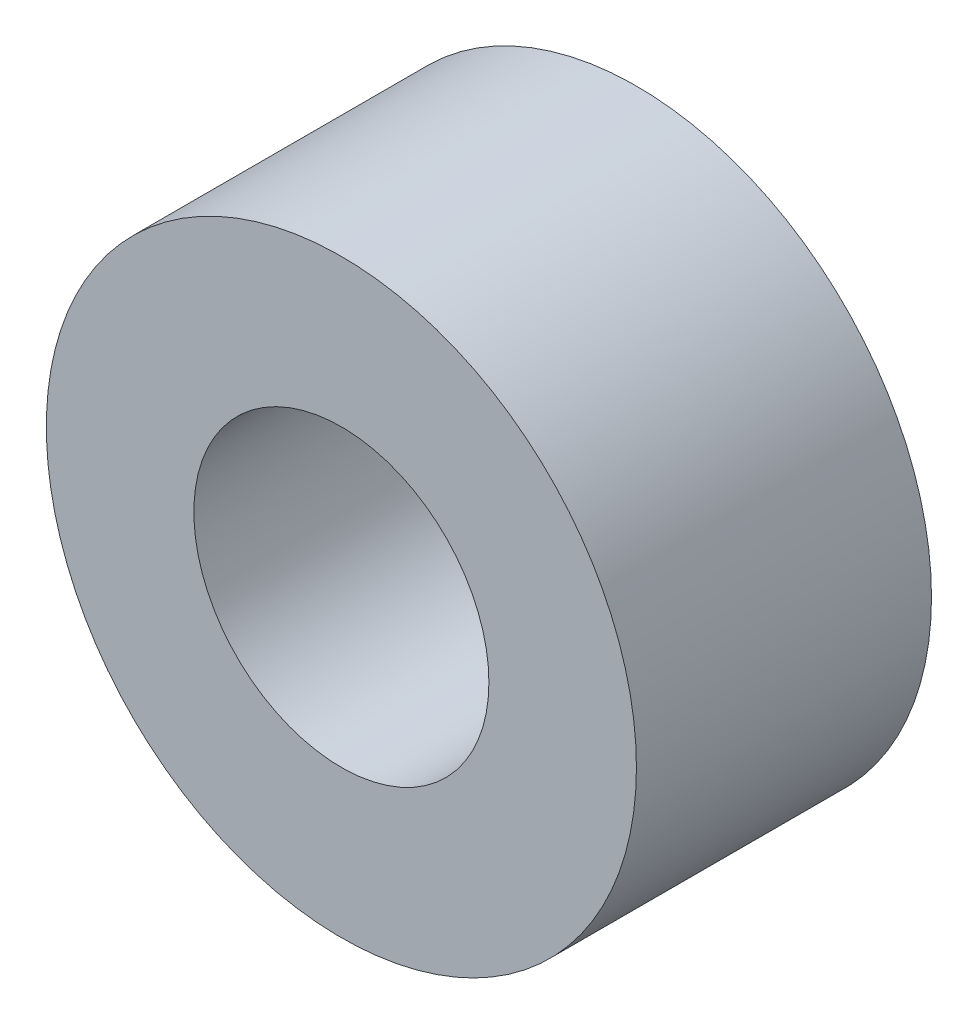
ISO-10303-21;
HEADER;
FILE_DESCRIPTION(('STEP AP214'),'2;1');
FILE_NAME('part.step','',(''),(''),'','','');
FILE_SCHEMA(('AUTOMOTIVE_DESIGN { 1 0 10303 214 1 1 1 1 }'));
ENDSEC;
DATA;
#1=APPLICATION_CONTEXT('core data for automotive mechanical design processes');
#2=APPLICATION_PROTOCOL_DEFINITION('international standard','automotive_design',2000,#1);
#3=PRODUCT_CONTEXT('',#1,'mechanical');
#4=PRODUCT('Part','Part','',(#3));
#5=PRODUCT_RELATED_PRODUCT_CATEGORY('part','',(#4));
#6=PRODUCT_DEFINITION_FORMATION('','',#4);
#7=PRODUCT_DEFINITION_CONTEXT('part definition',#1,'design');
#8=PRODUCT_DEFINITION('design','',#6,#7);
#9=PRODUCT_DEFINITION_SHAPE('','',#8);
#10=(LENGTH_UNIT() NAMED_UNIT(*) SI_UNIT(.MILLI.,.METRE.));
#11=(NAMED_UNIT(*) PLANE_ANGLE_UNIT() SI_UNIT($,.RADIAN.));
#12=(NAMED_UNIT(*) SI_UNIT($,.STERADIAN.) SOLID_ANGLE_UNIT());
#13=UNCERTAINTY_MEASURE_WITH_UNIT(LENGTH_MEASURE(1.E-05),#10,'distance_accuracy_value','');
#14=(GEOMETRIC_REPRESENTATION_CONTEXT(3) GLOBAL_UNCERTAINTY_ASSIGNED_CONTEXT((#13)) GLOBAL_UNIT_ASSIGNED_CONTEXT((#10,
#11,#12)) REPRESENTATION_CONTEXT('',''));
#15=CARTESIAN_POINT('',(0.,0.,0.));
#16=DIRECTION('',(0.,0.,1.));
#17=DIRECTION('',(1.,0.,0.));
#18=AXIS2_PLACEMENT_3D('',#15,#16,#17);
#19=CARTESIAN_POINT('',(0.,0.,5.));
#20=DIRECTION('',(0.,0.,1.));
#21=DIRECTION('',(1.,0.,0.));
#22=AXIS2_PLACEMENT_3D('',#19,#20,#21);
#23=PLANE('',#22);
#24=CARTESIAN_POINT('',(0.,0.,5.));
#25=DIRECTION('',(0.,0.,1.));
#26=DIRECTION('',(1.,0.,0.));
#27=AXIS2_PLACEMENT_3D('',#24,#25,#26);
#28=CIRCLE('',#27,5.);
#29=CARTESIAN_POINT('',(5.,0.,5.));
#30=VERTEX_POINT('',#29);
#31=EDGE_CURVE('E10',#30,#30,#28,.T.);
#32=ORIENTED_EDGE('',*,*,#31,.T.);
#33=EDGE_LOOP('',(#32));
#34=FACE_BOUND('',#33,.T.);
#35=CARTESIAN_POINT('',(0.,0.,5.));
#36=DIRECTION('',(0.,0.,1.));
#37=DIRECTION('',(1.,0.,0.));
#38=AXIS2_PLACEMENT_3D('',#35,#36,#37);
#39=CIRCLE('',#38,2.5);
#40=CARTESIAN_POINT('',(2.5,0.,5.));
#41=VERTEX_POINT('',#40);
#42=EDGE_CURVE('E50',#41,#41,#39,.T.);
#43=ORIENTED_EDGE('',*,*,#42,.F.);
#44=EDGE_LOOP('',(#43));
#45=FACE_BOUND('',#44,.T.);
#46=ADVANCED_FACE('F37',(#34,#45),#23,.T.);
#47=CARTESIAN_POINT('',(0.,0.,0.));
#48=DIRECTION('',(0.,0.,1.));
#49=DIRECTION('',(1.,0.,0.));
#50=AXIS2_PLACEMENT_3D('',#47,#48,#49);
#51=PLANE('',#50);
#52=CARTESIAN_POINT('',(0.,0.,0.));
#53=DIRECTION('',(0.,0.,1.));
#54=DIRECTION('',(1.,0.,0.));
#55=AXIS2_PLACEMENT_3D('',#52,#53,#54);
#56=CIRCLE('',#55,5.);
#57=CARTESIAN_POINT('',(5.,0.,0.));
#58=VERTEX_POINT('',#57);
#59=EDGE_CURVE('E41',#58,#58,#56,.T.);
#60=ORIENTED_EDGE('',*,*,#59,.F.);
#61=EDGE_LOOP('',(#60));
#62=FACE_BOUND('',#61,.T.);
#63=CARTESIAN_POINT('',(0.,0.,0.));
#64=DIRECTION('',(0.,0.,1.));
#65=DIRECTION('',(1.,0.,0.));
#66=AXIS2_PLACEMENT_3D('',#63,#64,#65);
#67=CIRCLE('',#66,2.5);
#68=CARTESIAN_POINT('',(2.5,0.,0.));
#69=VERTEX_POINT('',#68);
#70=EDGE_CURVE('E52',#69,#69,#67,.T.);
#71=ORIENTED_EDGE('',*,*,#70,.T.);
#72=EDGE_LOOP('',(#71));
#73=FACE_BOUND('',#72,.T.);
#74=ADVANCED_FACE('F64',(#62,#73),#51,.F.);
#75=CARTESIAN_POINT('',(0.,0.,5.));
#76=DIRECTION('',(0.,0.,-1.));
#77=DIRECTION('',(-1.,0.,0.));
#78=AXIS2_PLACEMENT_3D('',#75,#76,#77);
#79=CYLINDRICAL_SURFACE('',#78,5.);
#80=ORIENTED_EDGE('',*,*,#31,.F.);
#81=EDGE_LOOP('',(#80));
#82=FACE_BOUND('',#81,.T.);
#83=ORIENTED_EDGE('',*,*,#59,.T.);
#84=EDGE_LOOP('',(#83));
#85=FACE_BOUND('',#84,.T.);
#86=ADVANCED_FACE('F39',(#82,#85),#79,.T.);
#87=CARTESIAN_POINT('',(0.,0.,5.));
#88=DIRECTION('',(0.,0.,-1.));
#89=DIRECTION('',(-1.,0.,0.));
#90=AXIS2_PLACEMENT_3D('',#87,#88,#89);
#91=CYLINDRICAL_SURFACE('',#90,2.5);
#92=ORIENTED_EDGE('',*,*,#42,.T.);
#93=EDGE_LOOP('',(#92));
#94=FACE_BOUND('',#93,.T.);
#95=ORIENTED_EDGE('',*,*,#70,.F.);
#96=EDGE_LOOP('',(#95));
#97=FACE_BOUND('',#96,.T.);
#98=ADVANCED_FACE('F60',(#94,#97),#91,.F.);
#99=CLOSED_SHELL('',(#46,#74,#86,#98));
#100=MANIFOLD_SOLID_BREP('B2',#99);
#101=ADVANCED_BREP_SHAPE_REPRESENTATION('',(#18,#100),#14);
#102=SHAPE_DEFINITION_REPRESENTATION(#9,#101);
ENDSEC;
END-ISO-10303-21;
